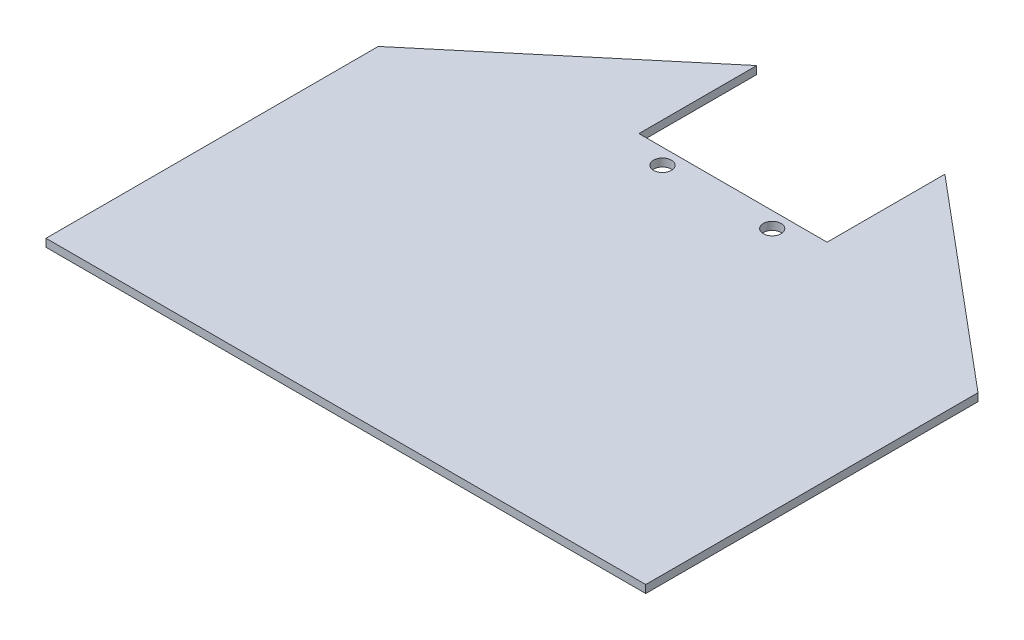
ISO-10303-21;
HEADER;
FILE_DESCRIPTION(('STEP AP214'),'2;1');
FILE_NAME('part.step','',(''),(''),'','','');
FILE_SCHEMA(('AUTOMOTIVE_DESIGN { 1 0 10303 214 1 1 1 1 }'));
ENDSEC;
DATA;
#1=APPLICATION_CONTEXT('core data for automotive mechanical design processes');
#2=APPLICATION_PROTOCOL_DEFINITION('international standard','automotive_design',2000,#1);
#3=PRODUCT_CONTEXT('',#1,'mechanical');
#4=PRODUCT('Part','Part','',(#3));
#5=PRODUCT_RELATED_PRODUCT_CATEGORY('part','',(#4));
#6=PRODUCT_DEFINITION_FORMATION('','',#4);
#7=PRODUCT_DEFINITION_CONTEXT('part definition',#1,'design');
#8=PRODUCT_DEFINITION('design','',#6,#7);
#9=PRODUCT_DEFINITION_SHAPE('','',#8);
#10=(LENGTH_UNIT() NAMED_UNIT(*) SI_UNIT(.MILLI.,.METRE.));
#11=(NAMED_UNIT(*) PLANE_ANGLE_UNIT() SI_UNIT($,.RADIAN.));
#12=(NAMED_UNIT(*) SI_UNIT($,.STERADIAN.) SOLID_ANGLE_UNIT());
#13=UNCERTAINTY_MEASURE_WITH_UNIT(LENGTH_MEASURE(1.E-05),#10,'distance_accuracy_value','');
#14=(GEOMETRIC_REPRESENTATION_CONTEXT(3) GLOBAL_UNCERTAINTY_ASSIGNED_CONTEXT((#13)) GLOBAL_UNIT_ASSIGNED_CONTEXT((#10,
#11,#12)) REPRESENTATION_CONTEXT('',''));
#15=CARTESIAN_POINT('',(0.,0.,0.));
#16=DIRECTION('',(0.,0.,1.));
#17=DIRECTION('',(1.,0.,0.));
#18=AXIS2_PLACEMENT_3D('',#15,#16,#17);
#19=CARTESIAN_POINT('',(76.5,2.,-42.3820614469772));
#20=DIRECTION('',(-1.,0.,0.));
#21=DIRECTION('',(0.,0.,1.));
#22=AXIS2_PLACEMENT_3D('',#19,#20,#21);
#23=PLANE('',#22);
#24=DIRECTION('',(0.,0.,-1.));
#25=VECTOR('',#24,1.);
#26=CARTESIAN_POINT('',(76.5,0.,-42.3820614469772));
#27=LINE('',#26,#25);
#28=CARTESIAN_POINT('',(76.5,0.,42.3820614469772));
#29=VERTEX_POINT('',#28);
#30=CARTESIAN_POINT('',(76.5,0.,-42.3820614469772));
#31=VERTEX_POINT('',#30);
#32=EDGE_CURVE('E147',#29,#31,#27,.T.);
#33=ORIENTED_EDGE('',*,*,#32,.T.);
#34=DIRECTION('',(0.,-1.,0.));
#35=VECTOR('',#34,1.);
#36=CARTESIAN_POINT('',(76.5,2.,-42.3820614469772));
#37=LINE('',#36,#35);
#38=CARTESIAN_POINT('',(76.5,2.,-42.3820614469772));
#39=VERTEX_POINT('',#38);
#40=EDGE_CURVE('E186',#39,#31,#37,.T.);
#41=ORIENTED_EDGE('',*,*,#40,.F.);
#42=DIRECTION('',(0.,0.,-1.));
#43=VECTOR('',#42,1.);
#44=CARTESIAN_POINT('',(76.5,2.,-42.3820614469772));
#45=LINE('',#44,#43);
#46=CARTESIAN_POINT('',(76.5,2.,42.3820614469772));
#47=VERTEX_POINT('',#46);
#48=EDGE_CURVE('E148',#47,#39,#45,.T.);
#49=ORIENTED_EDGE('',*,*,#48,.F.);
#50=DIRECTION('',(0.,-1.,0.));
#51=VECTOR('',#50,1.);
#52=CARTESIAN_POINT('',(76.5,2.,42.3820614469772));
#53=LINE('',#52,#51);
#54=EDGE_CURVE('E161',#47,#29,#53,.T.);
#55=ORIENTED_EDGE('',*,*,#54,.T.);
#56=EDGE_LOOP('',(#33,#41,#49,#55));
#57=FACE_BOUND('',#56,.T.);
#58=ADVANCED_FACE('F39',(#57),#23,.F.);
#59=CARTESIAN_POINT('',(0.,2.,-106.573183232039));
#60=DIRECTION('',(-0.642787609686541,0.,0.766044443118977));
#61=DIRECTION('',(0.766044443118977,0.,0.642787609686541));
#62=AXIS2_PLACEMENT_3D('',#59,#60,#61);
#63=PLANE('',#62);
#64=DIRECTION('',(-0.766044443118977,0.,-0.642787609686541));
#65=VECTOR('',#64,1.);
#66=CARTESIAN_POINT('',(0.,0.,-106.573183232039));
#67=LINE('',#66,#65);
#68=CARTESIAN_POINT('',(24.,0.,-86.4347920837846));
#69=VERTEX_POINT('',#68);
#70=EDGE_CURVE('E165',#31,#69,#67,.T.);
#71=ORIENTED_EDGE('',*,*,#70,.T.);
#72=DIRECTION('',(0.,1.,0.));
#73=VECTOR('',#72,1.);
#74=CARTESIAN_POINT('',(24.,2.,-86.4347920837846));
#75=LINE('',#74,#73);
#76=CARTESIAN_POINT('',(24.,2.,-86.4347920837846));
#77=VERTEX_POINT('',#76);
#78=EDGE_CURVE('E144',#69,#77,#75,.T.);
#79=ORIENTED_EDGE('',*,*,#78,.T.);
#80=DIRECTION('',(-0.766044443118977,0.,-0.642787609686541));
#81=VECTOR('',#80,1.);
#82=CARTESIAN_POINT('',(0.,2.,-106.573183232039));
#83=LINE('',#82,#81);
#84=EDGE_CURVE('E94',#39,#77,#83,.T.);
#85=ORIENTED_EDGE('',*,*,#84,.F.);
#86=ORIENTED_EDGE('',*,*,#40,.T.);
#87=EDGE_LOOP('',(#71,#79,#85,#86));
#88=FACE_BOUND('',#87,.T.);
#89=ADVANCED_FACE('F213',(#88),#63,.F.);
#90=CARTESIAN_POINT('',(-76.5,2.,-42.3820614469772));
#91=DIRECTION('',(0.642787609686541,0.,0.766044443118977));
#92=DIRECTION('',(0.766044443118977,0.,-0.642787609686541));
#93=AXIS2_PLACEMENT_3D('',#90,#91,#92);
#94=PLANE('',#93);
#95=DIRECTION('',(-0.766044443118977,0.,0.642787609686541));
#96=VECTOR('',#95,1.);
#97=CARTESIAN_POINT('',(-76.5,2.,-42.3820614469772));
#98=LINE('',#97,#96);
#99=CARTESIAN_POINT('',(-24.,2.,-86.4347920837846));
#100=VERTEX_POINT('',#99);
#101=CARTESIAN_POINT('',(-76.5,2.,-42.3820614469772));
#102=VERTEX_POINT('',#101);
#103=EDGE_CURVE('E153',#100,#102,#98,.T.);
#104=ORIENTED_EDGE('',*,*,#103,.F.);
#105=DIRECTION('',(0.,-1.,0.));
#106=VECTOR('',#105,1.);
#107=CARTESIAN_POINT('',(-24.,2.,-86.4347920837846));
#108=LINE('',#107,#106);
#109=CARTESIAN_POINT('',(-24.,0.,-86.4347920837846));
#110=VERTEX_POINT('',#109);
#111=EDGE_CURVE('E130',#100,#110,#108,.T.);
#112=ORIENTED_EDGE('',*,*,#111,.T.);
#113=DIRECTION('',(-0.766044443118977,0.,0.642787609686541));
#114=VECTOR('',#113,1.);
#115=CARTESIAN_POINT('',(-76.5,0.,-42.3820614469772));
#116=LINE('',#115,#114);
#117=CARTESIAN_POINT('',(-76.5,0.,-42.3820614469772));
#118=VERTEX_POINT('',#117);
#119=EDGE_CURVE('E169',#110,#118,#116,.T.);
#120=ORIENTED_EDGE('',*,*,#119,.T.);
#121=DIRECTION('',(0.,-1.,0.));
#122=VECTOR('',#121,1.);
#123=CARTESIAN_POINT('',(-76.5,2.,-42.3820614469772));
#124=LINE('',#123,#122);
#125=EDGE_CURVE('E182',#102,#118,#124,.T.);
#126=ORIENTED_EDGE('',*,*,#125,.F.);
#127=EDGE_LOOP('',(#104,#112,#120,#126));
#128=FACE_BOUND('',#127,.T.);
#129=ADVANCED_FACE('F223',(#128),#94,.F.);
#130=CARTESIAN_POINT('',(-76.5,2.,-42.3820614469772));
#131=DIRECTION('',(1.,0.,0.));
#132=DIRECTION('',(0.,0.,-1.));
#133=AXIS2_PLACEMENT_3D('',#130,#131,#132);
#134=PLANE('',#133);
#135=DIRECTION('',(0.,0.,1.));
#136=VECTOR('',#135,1.);
#137=CARTESIAN_POINT('',(-76.5,0.,-42.3820614469772));
#138=LINE('',#137,#136);
#139=CARTESIAN_POINT('',(-76.5,0.,42.3820614469772));
#140=VERTEX_POINT('',#139);
#141=EDGE_CURVE('E172',#118,#140,#138,.T.);
#142=ORIENTED_EDGE('',*,*,#141,.T.);
#143=DIRECTION('',(0.,-1.,0.));
#144=VECTOR('',#143,1.);
#145=CARTESIAN_POINT('',(-76.5,2.,42.3820614469772));
#146=LINE('',#145,#144);
#147=CARTESIAN_POINT('',(-76.5,2.,42.3820614469772));
#148=VERTEX_POINT('',#147);
#149=EDGE_CURVE('E179',#148,#140,#146,.T.);
#150=ORIENTED_EDGE('',*,*,#149,.F.);
#151=DIRECTION('',(0.,0.,1.));
#152=VECTOR('',#151,1.);
#153=CARTESIAN_POINT('',(-76.5,2.,-42.3820614469772));
#154=LINE('',#153,#152);
#155=EDGE_CURVE('E156',#102,#148,#154,.T.);
#156=ORIENTED_EDGE('',*,*,#155,.F.);
#157=ORIENTED_EDGE('',*,*,#125,.T.);
#158=EDGE_LOOP('',(#142,#150,#156,#157));
#159=FACE_BOUND('',#158,.T.);
#160=ADVANCED_FACE('F228',(#159),#134,.F.);
#161=CARTESIAN_POINT('',(-76.5,2.,42.3820614469772));
#162=DIRECTION('',(0.,0.,-1.));
#163=DIRECTION('',(-1.,0.,0.));
#164=AXIS2_PLACEMENT_3D('',#161,#162,#163);
#165=PLANE('',#164);
#166=DIRECTION('',(1.,0.,0.));
#167=VECTOR('',#166,1.);
#168=CARTESIAN_POINT('',(-76.5,0.,42.3820614469772));
#169=LINE('',#168,#167);
#170=EDGE_CURVE('E86',#140,#29,#169,.T.);
#171=ORIENTED_EDGE('',*,*,#170,.T.);
#172=ORIENTED_EDGE('',*,*,#54,.F.);
#173=DIRECTION('',(1.,0.,0.));
#174=VECTOR('',#173,1.);
#175=CARTESIAN_POINT('',(-76.5,2.,42.3820614469772));
#176=LINE('',#175,#174);
#177=EDGE_CURVE('E65',#148,#47,#176,.T.);
#178=ORIENTED_EDGE('',*,*,#177,.F.);
#179=ORIENTED_EDGE('',*,*,#149,.T.);
#180=EDGE_LOOP('',(#171,#172,#178,#179));
#181=FACE_BOUND('',#180,.T.);
#182=ADVANCED_FACE('F229',(#181),#165,.F.);
#183=CARTESIAN_POINT('',(0.,2.,0.));
#184=DIRECTION('',(0.,1.,0.));
#185=DIRECTION('',(0.,0.,1.));
#186=AXIS2_PLACEMENT_3D('',#183,#184,#185);
#187=PLANE('',#186);
#188=CARTESIAN_POINT('',(14.,2.,-52.3820614469772));
#189=DIRECTION('',(0.,1.,0.));
#190=DIRECTION('',(0.,0.,1.));
#191=AXIS2_PLACEMENT_3D('',#188,#189,#190);
#192=CIRCLE('',#191,2.275);
#193=CARTESIAN_POINT('',(14.,2.,-50.1070614469772));
#194=VERTEX_POINT('',#193);
#195=EDGE_CURVE('E196',#194,#194,#192,.T.);
#196=ORIENTED_EDGE('',*,*,#195,.F.);
#197=EDGE_LOOP('',(#196));
#198=FACE_BOUND('',#197,.T.);
#199=CARTESIAN_POINT('',(-14.,2.,-52.3820614469772));
#200=DIRECTION('',(0.,1.,0.));
#201=DIRECTION('',(0.,0.,-1.));
#202=AXIS2_PLACEMENT_3D('',#199,#200,#201);
#203=CIRCLE('',#202,2.275);
#204=CARTESIAN_POINT('',(-14.,2.,-54.6570614469772));
#205=VERTEX_POINT('',#204);
#206=EDGE_CURVE('E203',#205,#205,#203,.T.);
#207=ORIENTED_EDGE('',*,*,#206,.F.);
#208=EDGE_LOOP('',(#207));
#209=FACE_BOUND('',#208,.T.);
#210=DIRECTION('',(0.,0.,-1.));
#211=VECTOR('',#210,1.);
#212=CARTESIAN_POINT('',(24.,2.,-56.3820614469772));
#213=LINE('',#212,#211);
#214=CARTESIAN_POINT('',(24.,2.,-56.3820614469772));
#215=VERTEX_POINT('',#214);
#216=EDGE_CURVE('E133',#215,#77,#213,.T.);
#217=ORIENTED_EDGE('',*,*,#216,.F.);
#218=DIRECTION('',(1.,0.,0.));
#219=VECTOR('',#218,1.);
#220=CARTESIAN_POINT('',(-24.,2.,-56.3820614469772));
#221=LINE('',#220,#219);
#222=CARTESIAN_POINT('',(-24.,2.,-56.3820614469772));
#223=VERTEX_POINT('',#222);
#224=EDGE_CURVE('E119',#223,#215,#221,.T.);
#225=ORIENTED_EDGE('',*,*,#224,.F.);
#226=DIRECTION('',(0.,0.,1.));
#227=VECTOR('',#226,1.);
#228=CARTESIAN_POINT('',(-24.,2.,-56.3820614469772));
#229=LINE('',#228,#227);
#230=EDGE_CURVE('E127',#100,#223,#229,.T.);
#231=ORIENTED_EDGE('',*,*,#230,.F.);
#232=ORIENTED_EDGE('',*,*,#103,.T.);
#233=ORIENTED_EDGE('',*,*,#155,.T.);
#234=ORIENTED_EDGE('',*,*,#177,.T.);
#235=ORIENTED_EDGE('',*,*,#48,.T.);
#236=ORIENTED_EDGE('',*,*,#84,.T.);
#237=EDGE_LOOP('',(#217,#225,#231,#232,#233,#234,#235,#236));
#238=FACE_BOUND('',#237,.T.);
#239=ADVANCED_FACE('F135',(#198,#209,#238),#187,.T.);
#240=CARTESIAN_POINT('',(0.,0.,0.));
#241=DIRECTION('',(0.,1.,0.));
#242=DIRECTION('',(0.,0.,1.));
#243=AXIS2_PLACEMENT_3D('',#240,#241,#242);
#244=PLANE('',#243);
#245=CARTESIAN_POINT('',(14.,0.,-52.3820614469772));
#246=DIRECTION('',(0.,1.,0.));
#247=DIRECTION('',(0.,0.,1.));
#248=AXIS2_PLACEMENT_3D('',#245,#246,#247);
#249=CIRCLE('',#248,2.275);
#250=CARTESIAN_POINT('',(14.,0.,-50.1070614469772));
#251=VERTEX_POINT('',#250);
#252=EDGE_CURVE('E42',#251,#251,#249,.T.);
#253=ORIENTED_EDGE('',*,*,#252,.T.);
#254=EDGE_LOOP('',(#253));
#255=FACE_BOUND('',#254,.T.);
#256=CARTESIAN_POINT('',(-14.,0.,-52.3820614469772));
#257=DIRECTION('',(0.,1.,0.));
#258=DIRECTION('',(0.,0.,1.));
#259=AXIS2_PLACEMENT_3D('',#256,#257,#258);
#260=CIRCLE('',#259,2.275);
#261=CARTESIAN_POINT('',(-14.,0.,-50.1070614469772));
#262=VERTEX_POINT('',#261);
#263=EDGE_CURVE('E193',#262,#262,#260,.T.);
#264=ORIENTED_EDGE('',*,*,#263,.T.);
#265=EDGE_LOOP('',(#264));
#266=FACE_BOUND('',#265,.T.);
#267=DIRECTION('',(1.,0.,0.));
#268=VECTOR('',#267,1.);
#269=CARTESIAN_POINT('',(0.,0.,-56.3820614469772));
#270=LINE('',#269,#268);
#271=CARTESIAN_POINT('',(-24.,0.,-56.3820614469772));
#272=VERTEX_POINT('',#271);
#273=CARTESIAN_POINT('',(24.,0.,-56.3820614469772));
#274=VERTEX_POINT('',#273);
#275=EDGE_CURVE('E48',#272,#274,#270,.T.);
#276=ORIENTED_EDGE('',*,*,#275,.T.);
#277=DIRECTION('',(0.,0.,-1.));
#278=VECTOR('',#277,1.);
#279=CARTESIAN_POINT('',(24.,0.,0.));
#280=LINE('',#279,#278);
#281=EDGE_CURVE('E11',#274,#69,#280,.T.);
#282=ORIENTED_EDGE('',*,*,#281,.T.);
#283=ORIENTED_EDGE('',*,*,#70,.F.);
#284=ORIENTED_EDGE('',*,*,#32,.F.);
#285=ORIENTED_EDGE('',*,*,#170,.F.);
#286=ORIENTED_EDGE('',*,*,#141,.F.);
#287=ORIENTED_EDGE('',*,*,#119,.F.);
#288=DIRECTION('',(0.,0.,1.));
#289=VECTOR('',#288,1.);
#290=CARTESIAN_POINT('',(-24.,0.,0.));
#291=LINE('',#290,#289);
#292=EDGE_CURVE('E189',#110,#272,#291,.T.);
#293=ORIENTED_EDGE('',*,*,#292,.T.);
#294=EDGE_LOOP('',(#276,#282,#283,#284,#285,#286,#287,#293));
#295=FACE_BOUND('',#294,.T.);
#296=ADVANCED_FACE('F219',(#255,#266,#295),#244,.F.);
#297=CARTESIAN_POINT('',(24.,-8.,-56.3820614469772));
#298=DIRECTION('',(1.,0.,0.));
#299=DIRECTION('',(0.,0.,-1.));
#300=AXIS2_PLACEMENT_3D('',#297,#298,#299);
#301=PLANE('',#300);
#302=ORIENTED_EDGE('',*,*,#281,.F.);
#303=DIRECTION('',(0.,1.,0.));
#304=VECTOR('',#303,1.);
#305=CARTESIAN_POINT('',(24.,-8.,-56.3820614469772));
#306=LINE('',#305,#304);
#307=EDGE_CURVE('E124',#274,#215,#306,.T.);
#308=ORIENTED_EDGE('',*,*,#307,.T.);
#309=ORIENTED_EDGE('',*,*,#216,.T.);
#310=ORIENTED_EDGE('',*,*,#78,.F.);
#311=EDGE_LOOP('',(#302,#308,#309,#310));
#312=FACE_BOUND('',#311,.T.);
#313=ADVANCED_FACE('F212',(#312),#301,.F.);
#314=CARTESIAN_POINT('',(-24.,-8.,-56.3820614469772));
#315=DIRECTION('',(0.,0.,1.));
#316=DIRECTION('',(1.,0.,0.));
#317=AXIS2_PLACEMENT_3D('',#314,#315,#316);
#318=PLANE('',#317);
#319=DIRECTION('',(0.,1.,0.));
#320=VECTOR('',#319,1.);
#321=CARTESIAN_POINT('',(-24.,-8.,-56.3820614469772));
#322=LINE('',#321,#320);
#323=EDGE_CURVE('E56',#272,#223,#322,.T.);
#324=ORIENTED_EDGE('',*,*,#323,.T.);
#325=ORIENTED_EDGE('',*,*,#224,.T.);
#326=ORIENTED_EDGE('',*,*,#307,.F.);
#327=ORIENTED_EDGE('',*,*,#275,.F.);
#328=EDGE_LOOP('',(#324,#325,#326,#327));
#329=FACE_BOUND('',#328,.T.);
#330=ADVANCED_FACE('F116',(#329),#318,.F.);
#331=CARTESIAN_POINT('',(-24.,-8.,-56.3820614469772));
#332=DIRECTION('',(-1.,0.,0.));
#333=DIRECTION('',(0.,0.,1.));
#334=AXIS2_PLACEMENT_3D('',#331,#332,#333);
#335=PLANE('',#334);
#336=ORIENTED_EDGE('',*,*,#230,.T.);
#337=ORIENTED_EDGE('',*,*,#323,.F.);
#338=ORIENTED_EDGE('',*,*,#292,.F.);
#339=ORIENTED_EDGE('',*,*,#111,.F.);
#340=EDGE_LOOP('',(#336,#337,#338,#339));
#341=FACE_BOUND('',#340,.T.);
#342=ADVANCED_FACE('F128',(#341),#335,.F.);
#343=CARTESIAN_POINT('',(-14.,-8.,-52.3820614469772));
#344=DIRECTION('',(0.,1.,0.));
#345=DIRECTION('',(0.,0.,1.));
#346=AXIS2_PLACEMENT_3D('',#343,#344,#345);
#347=CYLINDRICAL_SURFACE('',#346,2.275);
#348=ORIENTED_EDGE('',*,*,#206,.T.);
#349=EDGE_LOOP('',(#348));
#350=FACE_BOUND('',#349,.T.);
#351=ORIENTED_EDGE('',*,*,#263,.F.);
#352=EDGE_LOOP('',(#351));
#353=FACE_BOUND('',#352,.T.);
#354=ADVANCED_FACE('F305',(#350,#353),#347,.F.);
#355=CARTESIAN_POINT('',(14.,-8.,-52.3820614469772));
#356=DIRECTION('',(0.,1.,0.));
#357=DIRECTION('',(0.,0.,1.));
#358=AXIS2_PLACEMENT_3D('',#355,#356,#357);
#359=CYLINDRICAL_SURFACE('',#358,2.275);
#360=ORIENTED_EDGE('',*,*,#195,.T.);
#361=EDGE_LOOP('',(#360));
#362=FACE_BOUND('',#361,.T.);
#363=ORIENTED_EDGE('',*,*,#252,.F.);
#364=EDGE_LOOP('',(#363));
#365=FACE_BOUND('',#364,.T.);
#366=ADVANCED_FACE('F312',(#362,#365),#359,.F.);
#367=CLOSED_SHELL('',(#58,#89,#129,#160,#182,#239,#296,#313,#330,#342,#354,#366));
#368=MANIFOLD_SOLID_BREP('B2',#367);
#369=ADVANCED_BREP_SHAPE_REPRESENTATION('',(#18,#368),#14);
#370=SHAPE_DEFINITION_REPRESENTATION(#9,#369);
ENDSEC;
END-ISO-10303-21;
